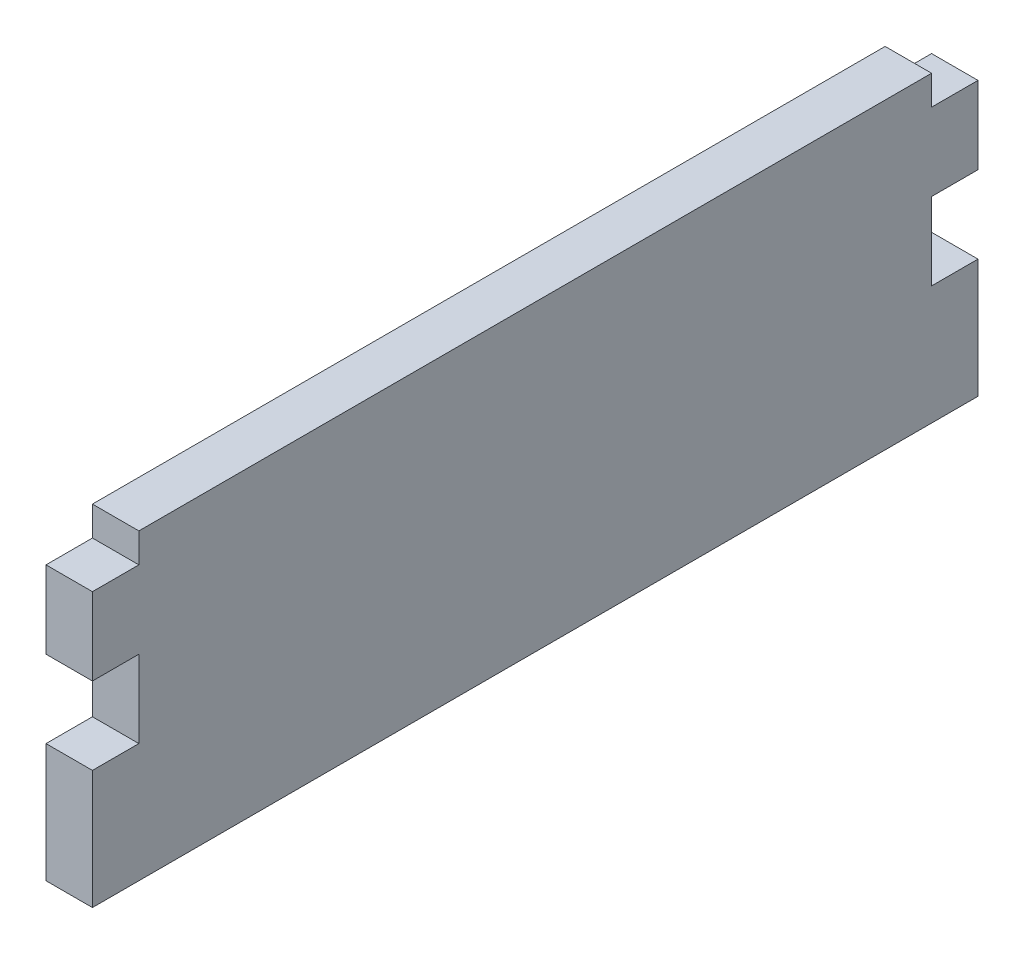
ISO-10303-21;
HEADER;
FILE_DESCRIPTION(('STEP AP214'),'2;1');
FILE_NAME('part.step','',(''),(''),'','','');
FILE_SCHEMA(('AUTOMOTIVE_DESIGN { 1 0 10303 214 1 1 1 1 }'));
ENDSEC;
DATA;
#1=APPLICATION_CONTEXT('core data for automotive mechanical design processes');
#2=APPLICATION_PROTOCOL_DEFINITION('international standard','automotive_design',2000,#1);
#3=PRODUCT_CONTEXT('',#1,'mechanical');
#4=PRODUCT('Part','Part','',(#3));
#5=PRODUCT_RELATED_PRODUCT_CATEGORY('part','',(#4));
#6=PRODUCT_DEFINITION_FORMATION('','',#4);
#7=PRODUCT_DEFINITION_CONTEXT('part definition',#1,'design');
#8=PRODUCT_DEFINITION('design','',#6,#7);
#9=PRODUCT_DEFINITION_SHAPE('','',#8);
#10=(LENGTH_UNIT() NAMED_UNIT(*) SI_UNIT(.MILLI.,.METRE.));
#11=(NAMED_UNIT(*) PLANE_ANGLE_UNIT() SI_UNIT($,.RADIAN.));
#12=(NAMED_UNIT(*) SI_UNIT($,.STERADIAN.) SOLID_ANGLE_UNIT());
#13=UNCERTAINTY_MEASURE_WITH_UNIT(LENGTH_MEASURE(1.E-05),#10,'distance_accuracy_value','');
#14=(GEOMETRIC_REPRESENTATION_CONTEXT(3) GLOBAL_UNCERTAINTY_ASSIGNED_CONTEXT((#13)) GLOBAL_UNIT_ASSIGNED_CONTEXT((#10,
#11,#12)) REPRESENTATION_CONTEXT('',''));
#15=CARTESIAN_POINT('',(0.,0.,0.));
#16=DIRECTION('',(0.,0.,1.));
#17=DIRECTION('',(1.,0.,0.));
#18=AXIS2_PLACEMENT_3D('',#15,#16,#17);
#19=CARTESIAN_POINT('',(6.,-97.5915565204714,2.98254336205769));
#20=DIRECTION('',(0.,0.,-1.));
#21=DIRECTION('',(0.,1.,0.));
#22=AXIS2_PLACEMENT_3D('',#19,#20,#21);
#23=PLANE('',#22);
#24=DIRECTION('',(0.,-1.,0.));
#25=VECTOR('',#24,1.);
#26=CARTESIAN_POINT('',(0.,-97.5915565204714,2.98254336205769));
#27=LINE('',#26,#25);
#28=CARTESIAN_POINT('',(0.,-97.5915565204714,2.98254336205769));
#29=VERTEX_POINT('',#28);
#30=CARTESIAN_POINT('',(0.,-101.391556520471,2.98254336205772));
#31=VERTEX_POINT('',#30);
#32=EDGE_CURVE('E177',#29,#31,#27,.T.);
#33=ORIENTED_EDGE('',*,*,#32,.F.);
#34=DIRECTION('',(-1.,0.,0.));
#35=VECTOR('',#34,1.);
#36=CARTESIAN_POINT('',(6.,-97.5915565204714,2.98254336205769));
#37=LINE('',#36,#35);
#38=CARTESIAN_POINT('',(6.,-97.5915565204714,2.98254336205769));
#39=VERTEX_POINT('',#38);
#40=EDGE_CURVE('E11',#39,#29,#37,.T.);
#41=ORIENTED_EDGE('',*,*,#40,.F.);
#42=DIRECTION('',(0.,-1.,0.));
#43=VECTOR('',#42,1.);
#44=CARTESIAN_POINT('',(6.,-97.5915565204714,2.98254336205769));
#45=LINE('',#44,#43);
#46=CARTESIAN_POINT('',(6.,-101.391556520471,2.98254336205772));
#47=VERTEX_POINT('',#46);
#48=EDGE_CURVE('E216',#39,#47,#45,.T.);
#49=ORIENTED_EDGE('',*,*,#48,.T.);
#50=DIRECTION('',(-1.,0.,0.));
#51=VECTOR('',#50,1.);
#52=CARTESIAN_POINT('',(6.,-101.391556520471,2.98254336205772));
#53=LINE('',#52,#51);
#54=EDGE_CURVE('E38',#47,#31,#53,.T.);
#55=ORIENTED_EDGE('',*,*,#54,.T.);
#56=EDGE_LOOP('',(#33,#41,#49,#55));
#57=FACE_BOUND('',#56,.T.);
#58=ADVANCED_FACE('F35',(#57),#23,.T.);
#59=CARTESIAN_POINT('',(6.,-97.5915565204714,105.412543362058));
#60=DIRECTION('',(0.,1.,0.));
#61=DIRECTION('',(0.,0.,1.));
#62=AXIS2_PLACEMENT_3D('',#59,#60,#61);
#63=PLANE('',#62);
#64=DIRECTION('',(0.,0.,-1.));
#65=VECTOR('',#64,1.);
#66=CARTESIAN_POINT('',(0.,-97.5915565204714,105.412543362058));
#67=LINE('',#66,#65);
#68=CARTESIAN_POINT('',(0.,-97.5915565204714,105.412543362058));
#69=VERTEX_POINT('',#68);
#70=EDGE_CURVE('E214',#69,#29,#67,.T.);
#71=ORIENTED_EDGE('',*,*,#70,.F.);
#72=DIRECTION('',(-1.,0.,0.));
#73=VECTOR('',#72,1.);
#74=CARTESIAN_POINT('',(6.,-97.5915565204714,105.412543362058));
#75=LINE('',#74,#73);
#76=CARTESIAN_POINT('',(6.,-97.5915565204714,105.412543362058));
#77=VERTEX_POINT('',#76);
#78=EDGE_CURVE('E44',#77,#69,#75,.T.);
#79=ORIENTED_EDGE('',*,*,#78,.F.);
#80=DIRECTION('',(0.,0.,-1.));
#81=VECTOR('',#80,1.);
#82=CARTESIAN_POINT('',(6.,-97.5915565204714,105.412543362058));
#83=LINE('',#82,#81);
#84=EDGE_CURVE('E172',#77,#39,#83,.T.);
#85=ORIENTED_EDGE('',*,*,#84,.T.);
#86=ORIENTED_EDGE('',*,*,#40,.T.);
#87=EDGE_LOOP('',(#71,#79,#85,#86));
#88=FACE_BOUND('',#87,.T.);
#89=ADVANCED_FACE('F250',(#88),#63,.T.);
#90=CARTESIAN_POINT('',(6.,-101.391556520471,105.412543362058));
#91=DIRECTION('',(0.,0.,1.));
#92=DIRECTION('',(1.,0.,0.));
#93=AXIS2_PLACEMENT_3D('',#90,#91,#92);
#94=PLANE('',#93);
#95=DIRECTION('',(0.,1.,0.));
#96=VECTOR('',#95,1.);
#97=CARTESIAN_POINT('',(0.,-101.391556520471,105.412543362058));
#98=LINE('',#97,#96);
#99=CARTESIAN_POINT('',(0.,-101.391556520471,105.412543362058));
#100=VERTEX_POINT('',#99);
#101=EDGE_CURVE('E158',#100,#69,#98,.T.);
#102=ORIENTED_EDGE('',*,*,#101,.F.);
#103=DIRECTION('',(-1.,0.,0.));
#104=VECTOR('',#103,1.);
#105=CARTESIAN_POINT('',(6.,-101.391556520471,105.412543362058));
#106=LINE('',#105,#104);
#107=CARTESIAN_POINT('',(6.,-101.391556520471,105.412543362058));
#108=VERTEX_POINT('',#107);
#109=EDGE_CURVE('E152',#108,#100,#106,.T.);
#110=ORIENTED_EDGE('',*,*,#109,.F.);
#111=DIRECTION('',(0.,1.,0.));
#112=VECTOR('',#111,1.);
#113=CARTESIAN_POINT('',(6.,-101.391556520471,105.412543362058));
#114=LINE('',#113,#112);
#115=EDGE_CURVE('E156',#108,#77,#114,.T.);
#116=ORIENTED_EDGE('',*,*,#115,.T.);
#117=ORIENTED_EDGE('',*,*,#78,.T.);
#118=EDGE_LOOP('',(#102,#110,#116,#117));
#119=FACE_BOUND('',#118,.T.);
#120=ADVANCED_FACE('F154',(#119),#94,.T.);
#121=CARTESIAN_POINT('',(6.,-101.391556520471,105.412543362058));
#122=DIRECTION('',(0.,-1.,0.));
#123=DIRECTION('',(0.,0.,-1.));
#124=AXIS2_PLACEMENT_3D('',#121,#122,#123);
#125=PLANE('',#124);
#126=DIRECTION('',(0.,0.,1.));
#127=VECTOR('',#126,1.);
#128=CARTESIAN_POINT('',(0.,-101.391556520471,105.412543362058));
#129=LINE('',#128,#127);
#130=CARTESIAN_POINT('',(0.,-101.391556520471,111.412543362058));
#131=VERTEX_POINT('',#130);
#132=EDGE_CURVE('E211',#100,#131,#129,.T.);
#133=ORIENTED_EDGE('',*,*,#132,.T.);
#134=DIRECTION('',(-1.,0.,0.));
#135=VECTOR('',#134,1.);
#136=CARTESIAN_POINT('',(6.,-101.391556520471,111.412543362058));
#137=LINE('',#136,#135);
#138=CARTESIAN_POINT('',(6.,-101.391556520471,111.412543362058));
#139=VERTEX_POINT('',#138);
#140=EDGE_CURVE('E161',#139,#131,#137,.T.);
#141=ORIENTED_EDGE('',*,*,#140,.F.);
#142=DIRECTION('',(0.,0.,1.));
#143=VECTOR('',#142,1.);
#144=CARTESIAN_POINT('',(6.,-101.391556520471,105.412543362058));
#145=LINE('',#144,#143);
#146=EDGE_CURVE('E164',#108,#139,#145,.T.);
#147=ORIENTED_EDGE('',*,*,#146,.F.);
#148=ORIENTED_EDGE('',*,*,#109,.T.);
#149=EDGE_LOOP('',(#133,#141,#147,#148));
#150=FACE_BOUND('',#149,.T.);
#151=ADVANCED_FACE('F165',(#150),#125,.F.);
#152=CARTESIAN_POINT('',(6.,-101.391556520471,111.412543362058));
#153=DIRECTION('',(0.,0.,-1.));
#154=DIRECTION('',(-1.,0.,0.));
#155=AXIS2_PLACEMENT_3D('',#152,#153,#154);
#156=PLANE('',#155);
#157=DIRECTION('',(0.,-1.,0.));
#158=VECTOR('',#157,1.);
#159=CARTESIAN_POINT('',(0.,-101.391556520471,111.412543362058));
#160=LINE('',#159,#158);
#161=CARTESIAN_POINT('',(0.,-111.391556520471,111.412543362058));
#162=VERTEX_POINT('',#161);
#163=EDGE_CURVE('E209',#131,#162,#160,.T.);
#164=ORIENTED_EDGE('',*,*,#163,.T.);
#165=DIRECTION('',(-1.,0.,0.));
#166=VECTOR('',#165,1.);
#167=CARTESIAN_POINT('',(6.,-111.391556520471,111.412543362058));
#168=LINE('',#167,#166);
#169=CARTESIAN_POINT('',(6.,-111.391556520471,111.412543362058));
#170=VERTEX_POINT('',#169);
#171=EDGE_CURVE('E220',#170,#162,#168,.T.);
#172=ORIENTED_EDGE('',*,*,#171,.F.);
#173=DIRECTION('',(0.,-1.,0.));
#174=VECTOR('',#173,1.);
#175=CARTESIAN_POINT('',(6.,-101.391556520471,111.412543362058));
#176=LINE('',#175,#174);
#177=EDGE_CURVE('E169',#139,#170,#176,.T.);
#178=ORIENTED_EDGE('',*,*,#177,.F.);
#179=ORIENTED_EDGE('',*,*,#140,.T.);
#180=EDGE_LOOP('',(#164,#172,#178,#179));
#181=FACE_BOUND('',#180,.T.);
#182=ADVANCED_FACE('F263',(#181),#156,.F.);
#183=CARTESIAN_POINT('',(6.,-111.391556520471,111.412543362058));
#184=DIRECTION('',(0.,1.,0.));
#185=DIRECTION('',(0.,0.,1.));
#186=AXIS2_PLACEMENT_3D('',#183,#184,#185);
#187=PLANE('',#186);
#188=DIRECTION('',(0.,0.,-1.));
#189=VECTOR('',#188,1.);
#190=CARTESIAN_POINT('',(0.,-111.391556520471,111.412543362058));
#191=LINE('',#190,#189);
#192=CARTESIAN_POINT('',(0.,-111.391556520471,105.412543362058));
#193=VERTEX_POINT('',#192);
#194=EDGE_CURVE('E207',#162,#193,#191,.T.);
#195=ORIENTED_EDGE('',*,*,#194,.T.);
#196=DIRECTION('',(-1.,0.,0.));
#197=VECTOR('',#196,1.);
#198=CARTESIAN_POINT('',(6.,-111.391556520471,105.412543362058));
#199=LINE('',#198,#197);
#200=CARTESIAN_POINT('',(6.,-111.391556520471,105.412543362058));
#201=VERTEX_POINT('',#200);
#202=EDGE_CURVE('E223',#201,#193,#199,.T.);
#203=ORIENTED_EDGE('',*,*,#202,.F.);
#204=DIRECTION('',(0.,0.,-1.));
#205=VECTOR('',#204,1.);
#206=CARTESIAN_POINT('',(6.,-111.391556520471,111.412543362058));
#207=LINE('',#206,#205);
#208=EDGE_CURVE('E455',#170,#201,#207,.T.);
#209=ORIENTED_EDGE('',*,*,#208,.F.);
#210=ORIENTED_EDGE('',*,*,#171,.T.);
#211=EDGE_LOOP('',(#195,#203,#209,#210));
#212=FACE_BOUND('',#211,.T.);
#213=ADVANCED_FACE('F266',(#212),#187,.F.);
#214=CARTESIAN_POINT('',(6.,-111.391556520471,105.412543362058));
#215=DIRECTION('',(0.,0.,-1.));
#216=DIRECTION('',(-1.,0.,0.));
#217=AXIS2_PLACEMENT_3D('',#214,#215,#216);
#218=PLANE('',#217);
#219=DIRECTION('',(0.,-1.,0.));
#220=VECTOR('',#219,1.);
#221=CARTESIAN_POINT('',(0.,-111.391556520471,105.412543362058));
#222=LINE('',#221,#220);
#223=CARTESIAN_POINT('',(0.,-121.391556520471,105.412543362058));
#224=VERTEX_POINT('',#223);
#225=EDGE_CURVE('E205',#193,#224,#222,.T.);
#226=ORIENTED_EDGE('',*,*,#225,.T.);
#227=DIRECTION('',(-1.,0.,0.));
#228=VECTOR('',#227,1.);
#229=CARTESIAN_POINT('',(6.,-121.391556520471,105.412543362058));
#230=LINE('',#229,#228);
#231=CARTESIAN_POINT('',(6.,-121.391556520471,105.412543362058));
#232=VERTEX_POINT('',#231);
#233=EDGE_CURVE('E226',#232,#224,#230,.T.);
#234=ORIENTED_EDGE('',*,*,#233,.F.);
#235=DIRECTION('',(0.,-1.,0.));
#236=VECTOR('',#235,1.);
#237=CARTESIAN_POINT('',(6.,-111.391556520471,105.412543362058));
#238=LINE('',#237,#236);
#239=EDGE_CURVE('E449',#201,#232,#238,.T.);
#240=ORIENTED_EDGE('',*,*,#239,.F.);
#241=ORIENTED_EDGE('',*,*,#202,.T.);
#242=EDGE_LOOP('',(#226,#234,#240,#241));
#243=FACE_BOUND('',#242,.T.);
#244=ADVANCED_FACE('F270',(#243),#218,.F.);
#245=CARTESIAN_POINT('',(6.,-121.391556520471,105.412543362058));
#246=DIRECTION('',(0.,-1.,0.));
#247=DIRECTION('',(0.,0.,-1.));
#248=AXIS2_PLACEMENT_3D('',#245,#246,#247);
#249=PLANE('',#248);
#250=DIRECTION('',(0.,0.,1.));
#251=VECTOR('',#250,1.);
#252=CARTESIAN_POINT('',(0.,-121.391556520471,105.412543362058));
#253=LINE('',#252,#251);
#254=CARTESIAN_POINT('',(0.,-121.391556520471,111.412543362058));
#255=VERTEX_POINT('',#254);
#256=EDGE_CURVE('E203',#224,#255,#253,.T.);
#257=ORIENTED_EDGE('',*,*,#256,.T.);
#258=DIRECTION('',(-1.,0.,0.));
#259=VECTOR('',#258,1.);
#260=CARTESIAN_POINT('',(6.,-121.391556520471,111.412543362058));
#261=LINE('',#260,#259);
#262=CARTESIAN_POINT('',(6.,-121.391556520471,111.412543362058));
#263=VERTEX_POINT('',#262);
#264=EDGE_CURVE('E229',#263,#255,#261,.T.);
#265=ORIENTED_EDGE('',*,*,#264,.F.);
#266=DIRECTION('',(0.,0.,1.));
#267=VECTOR('',#266,1.);
#268=CARTESIAN_POINT('',(6.,-121.391556520471,105.412543362058));
#269=LINE('',#268,#267);
#270=EDGE_CURVE('E446',#232,#263,#269,.T.);
#271=ORIENTED_EDGE('',*,*,#270,.F.);
#272=ORIENTED_EDGE('',*,*,#233,.T.);
#273=EDGE_LOOP('',(#257,#265,#271,#272));
#274=FACE_BOUND('',#273,.T.);
#275=ADVANCED_FACE('F274',(#274),#249,.F.);
#276=CARTESIAN_POINT('',(6.,-121.391556520471,111.412543362058));
#277=DIRECTION('',(0.,0.,-1.));
#278=DIRECTION('',(0.,1.,0.));
#279=AXIS2_PLACEMENT_3D('',#276,#277,#278);
#280=PLANE('',#279);
#281=DIRECTION('',(0.,-1.,0.));
#282=VECTOR('',#281,1.);
#283=CARTESIAN_POINT('',(0.,-121.391556520471,111.412543362058));
#284=LINE('',#283,#282);
#285=CARTESIAN_POINT('',(0.,-136.745366563869,111.412543362058));
#286=VERTEX_POINT('',#285);
#287=EDGE_CURVE('E201',#255,#286,#284,.T.);
#288=ORIENTED_EDGE('',*,*,#287,.T.);
#289=DIRECTION('',(-1.,0.,0.));
#290=VECTOR('',#289,1.);
#291=CARTESIAN_POINT('',(6.,-136.745366563869,111.412543362058));
#292=LINE('',#291,#290);
#293=CARTESIAN_POINT('',(6.,-136.745366563869,111.412543362058));
#294=VERTEX_POINT('',#293);
#295=EDGE_CURVE('E232',#294,#286,#292,.T.);
#296=ORIENTED_EDGE('',*,*,#295,.F.);
#297=DIRECTION('',(0.,1.,0.));
#298=VECTOR('',#297,1.);
#299=CARTESIAN_POINT('',(6.,-136.745366563869,111.412543362058));
#300=LINE('',#299,#298);
#301=EDGE_CURVE('E443',#294,#263,#300,.T.);
#302=ORIENTED_EDGE('',*,*,#301,.T.);
#303=ORIENTED_EDGE('',*,*,#264,.T.);
#304=EDGE_LOOP('',(#288,#296,#302,#303));
#305=FACE_BOUND('',#304,.T.);
#306=ADVANCED_FACE('F278',(#305),#280,.F.);
#307=CARTESIAN_POINT('',(6.,-136.745366563869,-3.01745663794222));
#308=DIRECTION('',(0.,-1.,0.));
#309=DIRECTION('',(0.,0.,-1.));
#310=AXIS2_PLACEMENT_3D('',#307,#308,#309);
#311=PLANE('',#310);
#312=DIRECTION('',(0.,0.,1.));
#313=VECTOR('',#312,1.);
#314=CARTESIAN_POINT('',(0.,-136.745366563869,-3.01745663794222));
#315=LINE('',#314,#313);
#316=CARTESIAN_POINT('',(0.,-136.745366563869,-3.01745663794222));
#317=VERTEX_POINT('',#316);
#318=EDGE_CURVE('E198',#317,#286,#315,.T.);
#319=ORIENTED_EDGE('',*,*,#318,.F.);
#320=DIRECTION('',(-1.,0.,0.));
#321=VECTOR('',#320,1.);
#322=CARTESIAN_POINT('',(6.,-136.745366563869,-3.01745663794222));
#323=LINE('',#322,#321);
#324=CARTESIAN_POINT('',(6.,-136.745366563869,-3.01745663794222));
#325=VERTEX_POINT('',#324);
#326=EDGE_CURVE('E235',#325,#317,#323,.T.);
#327=ORIENTED_EDGE('',*,*,#326,.F.);
#328=DIRECTION('',(0.,0.,1.));
#329=VECTOR('',#328,1.);
#330=CARTESIAN_POINT('',(6.,-136.745366563869,-3.01745663794222));
#331=LINE('',#330,#329);
#332=EDGE_CURVE('E441',#325,#294,#331,.T.);
#333=ORIENTED_EDGE('',*,*,#332,.T.);
#334=ORIENTED_EDGE('',*,*,#295,.T.);
#335=EDGE_LOOP('',(#319,#327,#333,#334));
#336=FACE_BOUND('',#335,.T.);
#337=ADVANCED_FACE('F282',(#336),#311,.T.);
#338=CARTESIAN_POINT('',(6.,-135.730110247325,-3.01745663794222));
#339=DIRECTION('',(0.,0.,-1.));
#340=DIRECTION('',(-1.,0.,0.));
#341=AXIS2_PLACEMENT_3D('',#338,#339,#340);
#342=PLANE('',#341);
#343=DIRECTION('',(0.,-1.,0.));
#344=VECTOR('',#343,1.);
#345=CARTESIAN_POINT('',(0.,-135.730110247325,-3.01745663794222));
#346=LINE('',#345,#344);
#347=CARTESIAN_POINT('',(0.,-121.391556520471,-3.0174566379423));
#348=VERTEX_POINT('',#347);
#349=EDGE_CURVE('E195',#348,#317,#346,.T.);
#350=ORIENTED_EDGE('',*,*,#349,.F.);
#351=DIRECTION('',(-1.,0.,0.));
#352=VECTOR('',#351,1.);
#353=CARTESIAN_POINT('',(6.,-121.391556520471,-3.0174566379423));
#354=LINE('',#353,#352);
#355=CARTESIAN_POINT('',(6.,-121.391556520471,-3.0174566379423));
#356=VERTEX_POINT('',#355);
#357=EDGE_CURVE('E237',#356,#348,#354,.T.);
#358=ORIENTED_EDGE('',*,*,#357,.F.);
#359=DIRECTION('',(0.,-1.,0.));
#360=VECTOR('',#359,1.);
#361=CARTESIAN_POINT('',(6.,-121.391556520471,-3.0174566379423));
#362=LINE('',#361,#360);
#363=EDGE_CURVE('E438',#356,#325,#362,.T.);
#364=ORIENTED_EDGE('',*,*,#363,.T.);
#365=ORIENTED_EDGE('',*,*,#326,.T.);
#366=EDGE_LOOP('',(#350,#358,#364,#365));
#367=FACE_BOUND('',#366,.T.);
#368=ADVANCED_FACE('F286',(#367),#342,.T.);
#369=CARTESIAN_POINT('',(6.,-121.391556520471,2.98254336205772));
#370=DIRECTION('',(0.,1.,0.));
#371=DIRECTION('',(0.,0.,1.));
#372=AXIS2_PLACEMENT_3D('',#369,#370,#371);
#373=PLANE('',#372);
#374=DIRECTION('',(0.,0.,-1.));
#375=VECTOR('',#374,1.);
#376=CARTESIAN_POINT('',(0.,-121.391556520471,2.98254336205772));
#377=LINE('',#376,#375);
#378=CARTESIAN_POINT('',(0.,-121.391556520471,2.98254336205772));
#379=VERTEX_POINT('',#378);
#380=EDGE_CURVE('E192',#379,#348,#377,.T.);
#381=ORIENTED_EDGE('',*,*,#380,.F.);
#382=DIRECTION('',(-1.,0.,0.));
#383=VECTOR('',#382,1.);
#384=CARTESIAN_POINT('',(6.,-121.391556520471,2.98254336205772));
#385=LINE('',#384,#383);
#386=CARTESIAN_POINT('',(6.,-121.391556520471,2.98254336205772));
#387=VERTEX_POINT('',#386);
#388=EDGE_CURVE('E240',#387,#379,#385,.T.);
#389=ORIENTED_EDGE('',*,*,#388,.F.);
#390=DIRECTION('',(0.,0.,-1.));
#391=VECTOR('',#390,1.);
#392=CARTESIAN_POINT('',(6.,-121.391556520471,2.98254336205772));
#393=LINE('',#392,#391);
#394=EDGE_CURVE('E466',#387,#356,#393,.T.);
#395=ORIENTED_EDGE('',*,*,#394,.T.);
#396=ORIENTED_EDGE('',*,*,#357,.T.);
#397=EDGE_LOOP('',(#381,#389,#395,#396));
#398=FACE_BOUND('',#397,.T.);
#399=ADVANCED_FACE('F290',(#398),#373,.T.);
#400=CARTESIAN_POINT('',(6.,-111.391556520471,2.98254336205772));
#401=DIRECTION('',(0.,0.,-1.));
#402=DIRECTION('',(-1.,0.,0.));
#403=AXIS2_PLACEMENT_3D('',#400,#401,#402);
#404=PLANE('',#403);
#405=DIRECTION('',(0.,-1.,0.));
#406=VECTOR('',#405,1.);
#407=CARTESIAN_POINT('',(0.,-111.391556520471,2.98254336205772));
#408=LINE('',#407,#406);
#409=CARTESIAN_POINT('',(0.,-111.391556520471,2.98254336205772));
#410=VERTEX_POINT('',#409);
#411=EDGE_CURVE('E189',#410,#379,#408,.T.);
#412=ORIENTED_EDGE('',*,*,#411,.F.);
#413=DIRECTION('',(-1.,0.,0.));
#414=VECTOR('',#413,1.);
#415=CARTESIAN_POINT('',(6.,-111.391556520471,2.98254336205772));
#416=LINE('',#415,#414);
#417=CARTESIAN_POINT('',(6.,-111.391556520471,2.98254336205772));
#418=VERTEX_POINT('',#417);
#419=EDGE_CURVE('E242',#418,#410,#416,.T.);
#420=ORIENTED_EDGE('',*,*,#419,.F.);
#421=DIRECTION('',(0.,-1.,0.));
#422=VECTOR('',#421,1.);
#423=CARTESIAN_POINT('',(6.,-111.391556520471,2.98254336205772));
#424=LINE('',#423,#422);
#425=EDGE_CURVE('E431',#418,#387,#424,.T.);
#426=ORIENTED_EDGE('',*,*,#425,.T.);
#427=ORIENTED_EDGE('',*,*,#388,.T.);
#428=EDGE_LOOP('',(#412,#420,#426,#427));
#429=FACE_BOUND('',#428,.T.);
#430=ADVANCED_FACE('F294',(#429),#404,.T.);
#431=CARTESIAN_POINT('',(6.,-111.391556520471,-3.0174566379423));
#432=DIRECTION('',(0.,-1.,0.));
#433=DIRECTION('',(0.,0.,-1.));
#434=AXIS2_PLACEMENT_3D('',#431,#432,#433);
#435=PLANE('',#434);
#436=DIRECTION('',(0.,0.,1.));
#437=VECTOR('',#436,1.);
#438=CARTESIAN_POINT('',(0.,-111.391556520471,-3.0174566379423));
#439=LINE('',#438,#437);
#440=CARTESIAN_POINT('',(0.,-111.391556520471,-3.0174566379423));
#441=VERTEX_POINT('',#440);
#442=EDGE_CURVE('E186',#441,#410,#439,.T.);
#443=ORIENTED_EDGE('',*,*,#442,.F.);
#444=DIRECTION('',(-1.,0.,0.));
#445=VECTOR('',#444,1.);
#446=CARTESIAN_POINT('',(6.,-111.391556520471,-3.0174566379423));
#447=LINE('',#446,#445);
#448=CARTESIAN_POINT('',(6.,-111.391556520471,-3.0174566379423));
#449=VERTEX_POINT('',#448);
#450=EDGE_CURVE('E244',#449,#441,#447,.T.);
#451=ORIENTED_EDGE('',*,*,#450,.F.);
#452=DIRECTION('',(0.,0.,1.));
#453=VECTOR('',#452,1.);
#454=CARTESIAN_POINT('',(6.,-111.391556520471,-3.0174566379423));
#455=LINE('',#454,#453);
#456=EDGE_CURVE('E427',#449,#418,#455,.T.);
#457=ORIENTED_EDGE('',*,*,#456,.T.);
#458=ORIENTED_EDGE('',*,*,#419,.T.);
#459=EDGE_LOOP('',(#443,#451,#457,#458));
#460=FACE_BOUND('',#459,.T.);
#461=ADVANCED_FACE('F298',(#460),#435,.T.);
#462=CARTESIAN_POINT('',(6.,-101.391556520471,-3.01745663794229));
#463=DIRECTION('',(0.,0.,-1.));
#464=DIRECTION('',(0.,1.,0.));
#465=AXIS2_PLACEMENT_3D('',#462,#463,#464);
#466=PLANE('',#465);
#467=DIRECTION('',(0.,-1.,0.));
#468=VECTOR('',#467,1.);
#469=CARTESIAN_POINT('',(0.,-101.391556520471,-3.01745663794229));
#470=LINE('',#469,#468);
#471=CARTESIAN_POINT('',(0.,-101.391556520471,-3.01745663794229));
#472=VERTEX_POINT('',#471);
#473=EDGE_CURVE('E183',#472,#441,#470,.T.);
#474=ORIENTED_EDGE('',*,*,#473,.F.);
#475=DIRECTION('',(-1.,0.,0.));
#476=VECTOR('',#475,1.);
#477=CARTESIAN_POINT('',(6.,-101.391556520471,-3.01745663794229));
#478=LINE('',#477,#476);
#479=CARTESIAN_POINT('',(6.,-101.391556520471,-3.01745663794229));
#480=VERTEX_POINT('',#479);
#481=EDGE_CURVE('E245',#480,#472,#478,.T.);
#482=ORIENTED_EDGE('',*,*,#481,.F.);
#483=DIRECTION('',(0.,-1.,0.));
#484=VECTOR('',#483,1.);
#485=CARTESIAN_POINT('',(6.,-101.391556520471,-3.01745663794229));
#486=LINE('',#485,#484);
#487=EDGE_CURVE('E470',#480,#449,#486,.T.);
#488=ORIENTED_EDGE('',*,*,#487,.T.);
#489=ORIENTED_EDGE('',*,*,#450,.T.);
#490=EDGE_LOOP('',(#474,#482,#488,#489));
#491=FACE_BOUND('',#490,.T.);
#492=ADVANCED_FACE('F302',(#491),#466,.T.);
#493=CARTESIAN_POINT('',(6.,-101.391556520471,2.98254336205772));
#494=DIRECTION('',(0.,1.,0.));
#495=DIRECTION('',(0.,0.,1.));
#496=AXIS2_PLACEMENT_3D('',#493,#494,#495);
#497=PLANE('',#496);
#498=DIRECTION('',(0.,0.,-1.));
#499=VECTOR('',#498,1.);
#500=CARTESIAN_POINT('',(0.,-101.391556520471,2.98254336205772));
#501=LINE('',#500,#499);
#502=EDGE_CURVE('E180',#31,#472,#501,.T.);
#503=ORIENTED_EDGE('',*,*,#502,.F.);
#504=ORIENTED_EDGE('',*,*,#54,.F.);
#505=DIRECTION('',(0.,0.,-1.));
#506=VECTOR('',#505,1.);
#507=CARTESIAN_POINT('',(6.,-101.391556520471,2.98254336205772));
#508=LINE('',#507,#506);
#509=EDGE_CURVE('E472',#47,#480,#508,.T.);
#510=ORIENTED_EDGE('',*,*,#509,.T.);
#511=ORIENTED_EDGE('',*,*,#481,.T.);
#512=EDGE_LOOP('',(#503,#504,#510,#511));
#513=FACE_BOUND('',#512,.T.);
#514=ADVANCED_FACE('F247',(#513),#497,.T.);
#515=CARTESIAN_POINT('',(6.,0.,0.));
#516=DIRECTION('',(1.,0.,0.));
#517=DIRECTION('',(0.,0.,-1.));
#518=AXIS2_PLACEMENT_3D('',#515,#516,#517);
#519=PLANE('',#518);
#520=ORIENTED_EDGE('',*,*,#48,.F.);
#521=ORIENTED_EDGE('',*,*,#84,.F.);
#522=ORIENTED_EDGE('',*,*,#115,.F.);
#523=ORIENTED_EDGE('',*,*,#146,.T.);
#524=ORIENTED_EDGE('',*,*,#177,.T.);
#525=ORIENTED_EDGE('',*,*,#208,.T.);
#526=ORIENTED_EDGE('',*,*,#239,.T.);
#527=ORIENTED_EDGE('',*,*,#270,.T.);
#528=ORIENTED_EDGE('',*,*,#301,.F.);
#529=ORIENTED_EDGE('',*,*,#332,.F.);
#530=ORIENTED_EDGE('',*,*,#363,.F.);
#531=ORIENTED_EDGE('',*,*,#394,.F.);
#532=ORIENTED_EDGE('',*,*,#425,.F.);
#533=ORIENTED_EDGE('',*,*,#456,.F.);
#534=ORIENTED_EDGE('',*,*,#487,.F.);
#535=ORIENTED_EDGE('',*,*,#509,.F.);
#536=EDGE_LOOP('',(#520,#521,#522,#523,#524,#525,#526,#527,#528,#529,#530,#531,#532,#533,#534,#535));
#537=FACE_BOUND('',#536,.T.);
#538=ADVANCED_FACE('F171',(#537),#519,.T.);
#539=CARTESIAN_POINT('',(0.,0.,0.));
#540=DIRECTION('',(1.,0.,0.));
#541=DIRECTION('',(0.,0.,-1.));
#542=AXIS2_PLACEMENT_3D('',#539,#540,#541);
#543=PLANE('',#542);
#544=ORIENTED_EDGE('',*,*,#32,.T.);
#545=ORIENTED_EDGE('',*,*,#502,.T.);
#546=ORIENTED_EDGE('',*,*,#473,.T.);
#547=ORIENTED_EDGE('',*,*,#442,.T.);
#548=ORIENTED_EDGE('',*,*,#411,.T.);
#549=ORIENTED_EDGE('',*,*,#380,.T.);
#550=ORIENTED_EDGE('',*,*,#349,.T.);
#551=ORIENTED_EDGE('',*,*,#318,.T.);
#552=ORIENTED_EDGE('',*,*,#287,.F.);
#553=ORIENTED_EDGE('',*,*,#256,.F.);
#554=ORIENTED_EDGE('',*,*,#225,.F.);
#555=ORIENTED_EDGE('',*,*,#194,.F.);
#556=ORIENTED_EDGE('',*,*,#163,.F.);
#557=ORIENTED_EDGE('',*,*,#132,.F.);
#558=ORIENTED_EDGE('',*,*,#101,.T.);
#559=ORIENTED_EDGE('',*,*,#70,.T.);
#560=EDGE_LOOP('',(#544,#545,#546,#547,#548,#549,#550,#551,#552,#553,#554,#555,#556,#557,#558,#559));
#561=FACE_BOUND('',#560,.T.);
#562=ADVANCED_FACE('F249',(#561),#543,.F.);
#563=CLOSED_SHELL('',(#58,#89,#120,#151,#182,#213,#244,#275,#306,#337,#368,#399,#430,#461,#492,
#514,#538,#562));
#564=MANIFOLD_SOLID_BREP('B2',#563);
#565=ADVANCED_BREP_SHAPE_REPRESENTATION('',(#18,#564),#14);
#566=SHAPE_DEFINITION_REPRESENTATION(#9,#565);
ENDSEC;
END-ISO-10303-21;
